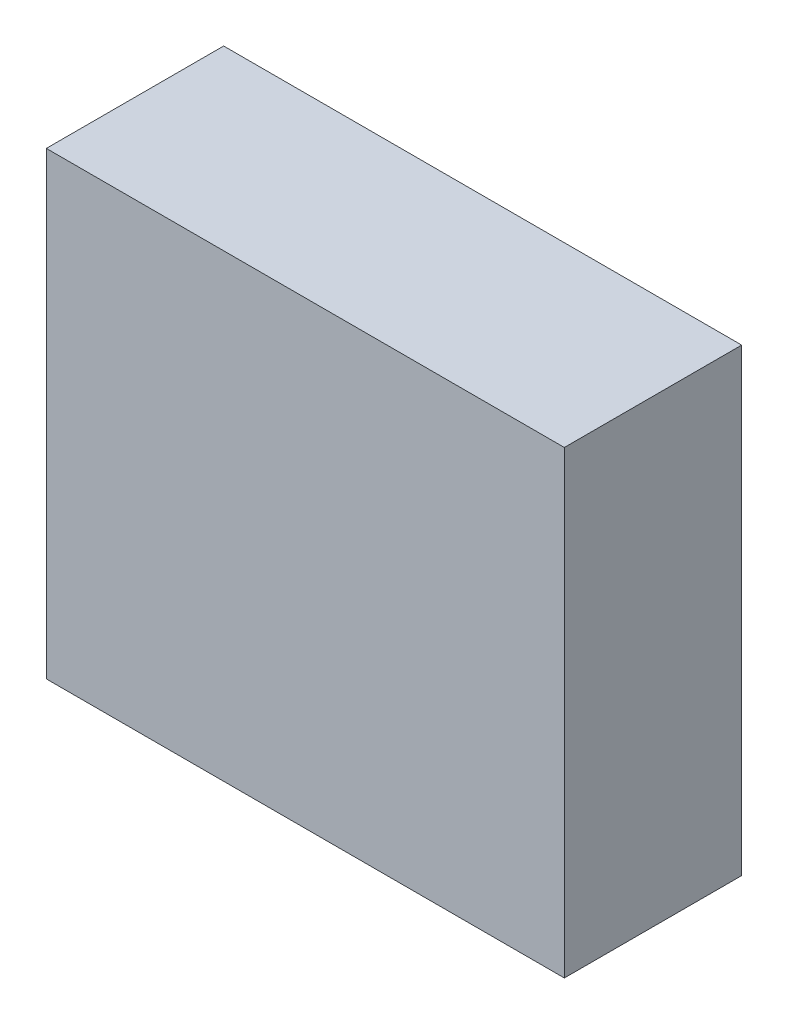
ISO-10303-21;
HEADER;
FILE_DESCRIPTION(('STEP AP214'),'2;1');
FILE_NAME('part.step','',(''),(''),'','','');
FILE_SCHEMA(('AUTOMOTIVE_DESIGN { 1 0 10303 214 1 1 1 1 }'));
ENDSEC;
DATA;
#1=APPLICATION_CONTEXT('core data for automotive mechanical design processes');
#2=APPLICATION_PROTOCOL_DEFINITION('international standard','automotive_design',2000,#1);
#3=PRODUCT_CONTEXT('',#1,'mechanical');
#4=PRODUCT('Part','Part','',(#3));
#5=PRODUCT_RELATED_PRODUCT_CATEGORY('part','',(#4));
#6=PRODUCT_DEFINITION_FORMATION('','',#4);
#7=PRODUCT_DEFINITION_CONTEXT('part definition',#1,'design');
#8=PRODUCT_DEFINITION('design','',#6,#7);
#9=PRODUCT_DEFINITION_SHAPE('','',#8);
#10=(LENGTH_UNIT() NAMED_UNIT(*) SI_UNIT(.MILLI.,.METRE.));
#11=(NAMED_UNIT(*) PLANE_ANGLE_UNIT() SI_UNIT($,.RADIAN.));
#12=(NAMED_UNIT(*) SI_UNIT($,.STERADIAN.) SOLID_ANGLE_UNIT());
#13=UNCERTAINTY_MEASURE_WITH_UNIT(LENGTH_MEASURE(1.E-05),#10,'distance_accuracy_value','');
#14=(GEOMETRIC_REPRESENTATION_CONTEXT(3) GLOBAL_UNCERTAINTY_ASSIGNED_CONTEXT((#13)) GLOBAL_UNIT_ASSIGNED_CONTEXT((#10,
#11,#12)) REPRESENTATION_CONTEXT('',''));
#15=CARTESIAN_POINT('',(0.,0.,0.));
#16=DIRECTION('',(0.,0.,1.));
#17=DIRECTION('',(1.,0.,0.));
#18=AXIS2_PLACEMENT_3D('',#15,#16,#17);
#19=CARTESIAN_POINT('',(-1.4224,1.2954,1.));
#20=DIRECTION('',(0.,0.,1.));
#21=DIRECTION('',(1.,0.,0.));
#22=AXIS2_PLACEMENT_3D('',#19,#20,#21);
#23=PLANE('',#22);
#24=DIRECTION('',(0.,1.,0.));
#25=VECTOR('',#24,1.);
#26=CARTESIAN_POINT('',(1.4986,1.2954,1.));
#27=LINE('',#26,#25);
#28=CARTESIAN_POINT('',(1.4986,1.2954,1.));
#29=VERTEX_POINT('',#28);
#30=CARTESIAN_POINT('',(1.4986,-1.2954,1.));
#31=VERTEX_POINT('',#30);
#32=EDGE_CURVE('E53',#29,#31,#27,.F.);
#33=ORIENTED_EDGE('',*,*,#32,.F.);
#34=DIRECTION('',(1.,0.,0.));
#35=VECTOR('',#34,1.);
#36=CARTESIAN_POINT('',(-1.4224,1.2954,1.));
#37=LINE('',#36,#35);
#38=CARTESIAN_POINT('',(-1.4224,1.2954,1.));
#39=VERTEX_POINT('',#38);
#40=EDGE_CURVE('E68',#39,#29,#37,.T.);
#41=ORIENTED_EDGE('',*,*,#40,.F.);
#42=DIRECTION('',(0.,1.,0.));
#43=VECTOR('',#42,1.);
#44=CARTESIAN_POINT('',(-1.4224,-1.2954,1.));
#45=LINE('',#44,#43);
#46=CARTESIAN_POINT('',(-1.4224,-1.2954,1.));
#47=VERTEX_POINT('',#46);
#48=EDGE_CURVE('E20',#47,#39,#45,.T.);
#49=ORIENTED_EDGE('',*,*,#48,.F.);
#50=DIRECTION('',(1.,0.,0.));
#51=VECTOR('',#50,1.);
#52=CARTESIAN_POINT('',(1.4986,-1.2954,1.));
#53=LINE('',#52,#51);
#54=EDGE_CURVE('E58',#31,#47,#53,.F.);
#55=ORIENTED_EDGE('',*,*,#54,.F.);
#56=EDGE_LOOP('',(#33,#41,#49,#55));
#57=FACE_BOUND('',#56,.T.);
#58=ADVANCED_FACE('F17',(#57),#23,.T.);
#59=CARTESIAN_POINT('',(-1.4224,-1.2954,0.));
#60=DIRECTION('',(-1.,0.,0.));
#61=DIRECTION('',(0.,0.,1.));
#62=AXIS2_PLACEMENT_3D('',#59,#60,#61);
#63=PLANE('',#62);
#64=DIRECTION('',(0.,0.,1.));
#65=VECTOR('',#64,1.);
#66=CARTESIAN_POINT('',(-1.4224,1.2954,0.));
#67=LINE('',#66,#65);
#68=CARTESIAN_POINT('',(-1.4224,1.2954,0.));
#69=VERTEX_POINT('',#68);
#70=EDGE_CURVE('E79',#69,#39,#67,.T.);
#71=ORIENTED_EDGE('',*,*,#70,.F.);
#72=DIRECTION('',(0.,1.,0.));
#73=VECTOR('',#72,1.);
#74=CARTESIAN_POINT('',(-1.4224,1.2954,0.));
#75=LINE('',#74,#73);
#76=CARTESIAN_POINT('',(-1.4224,-1.2954,0.));
#77=VERTEX_POINT('',#76);
#78=EDGE_CURVE('E74',#69,#77,#75,.F.);
#79=ORIENTED_EDGE('',*,*,#78,.T.);
#80=DIRECTION('',(0.,0.,-1.));
#81=VECTOR('',#80,1.);
#82=CARTESIAN_POINT('',(-1.4224,-1.2954,0.));
#83=LINE('',#82,#81);
#84=EDGE_CURVE('E63',#47,#77,#83,.T.);
#85=ORIENTED_EDGE('',*,*,#84,.F.);
#86=ORIENTED_EDGE('',*,*,#48,.T.);
#87=EDGE_LOOP('',(#71,#79,#85,#86));
#88=FACE_BOUND('',#87,.T.);
#89=ADVANCED_FACE('F73',(#88),#63,.T.);
#90=CARTESIAN_POINT('',(1.4986,-1.2954,0.));
#91=DIRECTION('',(0.,-1.,0.));
#92=DIRECTION('',(0.,0.,-1.));
#93=AXIS2_PLACEMENT_3D('',#90,#91,#92);
#94=PLANE('',#93);
#95=ORIENTED_EDGE('',*,*,#84,.T.);
#96=DIRECTION('',(1.,0.,0.));
#97=VECTOR('',#96,1.);
#98=CARTESIAN_POINT('',(-1.4224,-1.2954,0.));
#99=LINE('',#98,#97);
#100=CARTESIAN_POINT('',(1.4986,-1.2954,0.));
#101=VERTEX_POINT('',#100);
#102=EDGE_CURVE('E84',#77,#101,#99,.T.);
#103=ORIENTED_EDGE('',*,*,#102,.T.);
#104=DIRECTION('',(0.,0.,-1.));
#105=VECTOR('',#104,1.);
#106=CARTESIAN_POINT('',(1.4986,-1.2954,0.));
#107=LINE('',#106,#105);
#108=EDGE_CURVE('E65',#31,#101,#107,.T.);
#109=ORIENTED_EDGE('',*,*,#108,.F.);
#110=ORIENTED_EDGE('',*,*,#54,.T.);
#111=EDGE_LOOP('',(#95,#103,#109,#110));
#112=FACE_BOUND('',#111,.T.);
#113=ADVANCED_FACE('F60',(#112),#94,.T.);
#114=CARTESIAN_POINT('',(1.4986,1.2954,0.));
#115=DIRECTION('',(1.,0.,0.));
#116=DIRECTION('',(0.,0.,-1.));
#117=AXIS2_PLACEMENT_3D('',#114,#115,#116);
#118=PLANE('',#117);
#119=ORIENTED_EDGE('',*,*,#108,.T.);
#120=DIRECTION('',(0.,1.,0.));
#121=VECTOR('',#120,1.);
#122=CARTESIAN_POINT('',(1.4986,1.2954,0.));
#123=LINE('',#122,#121);
#124=CARTESIAN_POINT('',(1.4986,1.2954,0.));
#125=VERTEX_POINT('',#124);
#126=EDGE_CURVE('E26',#101,#125,#123,.T.);
#127=ORIENTED_EDGE('',*,*,#126,.T.);
#128=DIRECTION('',(0.,0.,1.));
#129=VECTOR('',#128,1.);
#130=CARTESIAN_POINT('',(1.4986,1.2954,0.));
#131=LINE('',#130,#129);
#132=EDGE_CURVE('E34',#29,#125,#131,.F.);
#133=ORIENTED_EDGE('',*,*,#132,.F.);
#134=ORIENTED_EDGE('',*,*,#32,.T.);
#135=EDGE_LOOP('',(#119,#127,#133,#134));
#136=FACE_BOUND('',#135,.T.);
#137=ADVANCED_FACE('F88',(#136),#118,.T.);
#138=CARTESIAN_POINT('',(-1.4224,1.2954,0.));
#139=DIRECTION('',(0.,1.,0.));
#140=DIRECTION('',(0.,0.,1.));
#141=AXIS2_PLACEMENT_3D('',#138,#139,#140);
#142=PLANE('',#141);
#143=ORIENTED_EDGE('',*,*,#132,.T.);
#144=DIRECTION('',(1.,0.,0.));
#145=VECTOR('',#144,1.);
#146=CARTESIAN_POINT('',(-1.4224,1.2954,0.));
#147=LINE('',#146,#145);
#148=EDGE_CURVE('E11',#125,#69,#147,.F.);
#149=ORIENTED_EDGE('',*,*,#148,.T.);
#150=ORIENTED_EDGE('',*,*,#70,.T.);
#151=ORIENTED_EDGE('',*,*,#40,.T.);
#152=EDGE_LOOP('',(#143,#149,#150,#151));
#153=FACE_BOUND('',#152,.T.);
#154=ADVANCED_FACE('F91',(#153),#142,.T.);
#155=CARTESIAN_POINT('',(-1.4224,1.2954,0.));
#156=DIRECTION('',(0.,0.,1.));
#157=DIRECTION('',(1.,0.,0.));
#158=AXIS2_PLACEMENT_3D('',#155,#156,#157);
#159=PLANE('',#158);
#160=ORIENTED_EDGE('',*,*,#126,.F.);
#161=ORIENTED_EDGE('',*,*,#102,.F.);
#162=ORIENTED_EDGE('',*,*,#78,.F.);
#163=ORIENTED_EDGE('',*,*,#148,.F.);
#164=EDGE_LOOP('',(#160,#161,#162,#163));
#165=FACE_BOUND('',#164,.T.);
#166=ADVANCED_FACE('F90',(#165),#159,.F.);
#167=CLOSED_SHELL('',(#58,#89,#113,#137,#154,#166));
#168=MANIFOLD_SOLID_BREP('B1',#167);
#169=ADVANCED_BREP_SHAPE_REPRESENTATION('',(#18,#168),#14);
#170=SHAPE_DEFINITION_REPRESENTATION(#9,#169);
ENDSEC;
END-ISO-10303-21;
